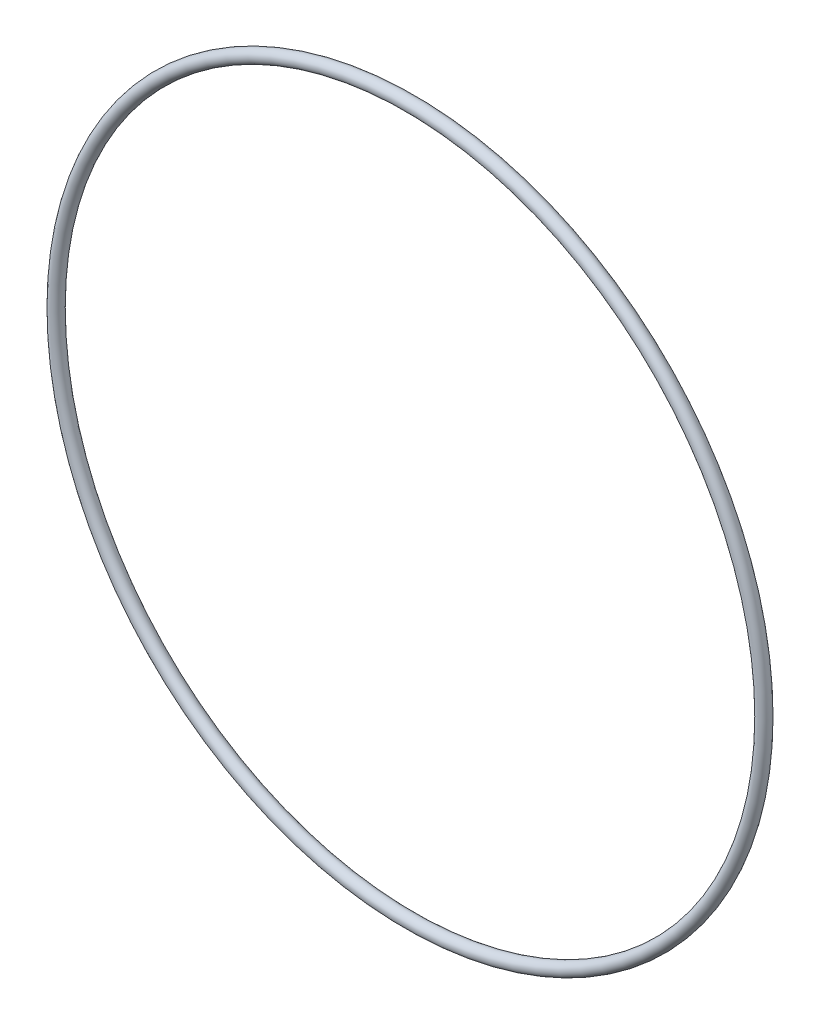
ISO-10303-21;
HEADER;
FILE_DESCRIPTION(('STEP AP214'),'2;1');
FILE_NAME('part.step','',(''),(''),'','','');
FILE_SCHEMA(('AUTOMOTIVE_DESIGN { 1 0 10303 214 1 1 1 1 }'));
ENDSEC;
DATA;
#1=APPLICATION_CONTEXT('core data for automotive mechanical design processes');
#2=APPLICATION_PROTOCOL_DEFINITION('international standard','automotive_design',2000,#1);
#3=PRODUCT_CONTEXT('',#1,'mechanical');
#4=PRODUCT('Part','Part','',(#3));
#5=PRODUCT_RELATED_PRODUCT_CATEGORY('part','',(#4));
#6=PRODUCT_DEFINITION_FORMATION('','',#4);
#7=PRODUCT_DEFINITION_CONTEXT('part definition',#1,'design');
#8=PRODUCT_DEFINITION('design','',#6,#7);
#9=PRODUCT_DEFINITION_SHAPE('','',#8);
#10=(LENGTH_UNIT() NAMED_UNIT(*) SI_UNIT(.MILLI.,.METRE.));
#11=(NAMED_UNIT(*) PLANE_ANGLE_UNIT() SI_UNIT($,.RADIAN.));
#12=(NAMED_UNIT(*) SI_UNIT($,.STERADIAN.) SOLID_ANGLE_UNIT());
#13=UNCERTAINTY_MEASURE_WITH_UNIT(LENGTH_MEASURE(1.E-05),#10,'distance_accuracy_value','');
#14=(GEOMETRIC_REPRESENTATION_CONTEXT(3) GLOBAL_UNCERTAINTY_ASSIGNED_CONTEXT((#13)) GLOBAL_UNIT_ASSIGNED_CONTEXT((#10,
#11,#12)) REPRESENTATION_CONTEXT('',''));
#15=CARTESIAN_POINT('',(0.,0.,0.));
#16=DIRECTION('',(0.,0.,1.));
#17=DIRECTION('',(1.,0.,0.));
#18=AXIS2_PLACEMENT_3D('',#15,#16,#17);
#19=CARTESIAN_POINT('',(0.,0.,0.));
#20=DIRECTION('',(0.,0.,1.));
#21=DIRECTION('',(1.,0.,0.));
#22=AXIS2_PLACEMENT_3D('',#19,#20,#21);
#23=TOROIDAL_SURFACE('',#22,44.5,0.812800000000002);
#24=CARTESIAN_POINT('',(44.5,0.,0.));
#25=DIRECTION('',(0.,1.,0.));
#26=DIRECTION('',(-1.,0.,0.));
#27=AXIS2_PLACEMENT_3D('',#24,#25,#26);
#28=CIRCLE('',#27,0.812800000000002);
#29=CARTESIAN_POINT('',(45.3128,0.,0.));
#30=VERTEX_POINT('',#29);
#31=EDGE_CURVE('E11',#30,#30,#28,.T.);
#32=CARTESIAN_POINT('',(0.,0.,0.));
#33=DIRECTION('',(0.,0.,1.));
#34=DIRECTION('',(1.,0.,0.));
#35=AXIS2_PLACEMENT_3D('',#32,#33,#34);
#36=CIRCLE('',#35,45.3128);
#37=EDGE_CURVE('',#30,#30,#36,.T.);
#38=ORIENTED_EDGE('',*,*,#31,.T.);
#39=ORIENTED_EDGE('',*,*,#31,.F.);
#40=ORIENTED_EDGE('',*,*,#37,.T.);
#41=ORIENTED_EDGE('',*,*,#37,.F.);
#42=EDGE_LOOP('',(#38,#40,#39,#41));
#43=FACE_BOUND('',#42,.T.);
#44=ADVANCED_FACE('F49',(#43),#23,.T.);
#45=CLOSED_SHELL('',(#44));
#46=MANIFOLD_SOLID_BREP('B2',#45);
#47=ADVANCED_BREP_SHAPE_REPRESENTATION('',(#18,#46),#14);
#48=SHAPE_DEFINITION_REPRESENTATION(#9,#47);
ENDSEC;
END-ISO-10303-21;
